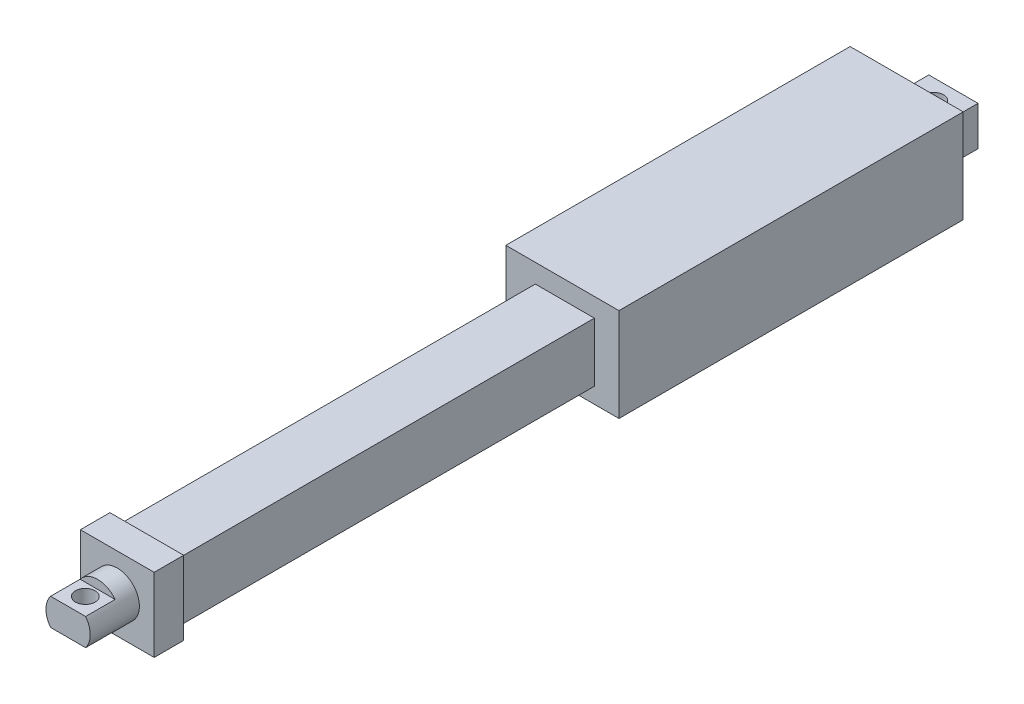
ISO-10303-21;
HEADER;
FILE_DESCRIPTION(('STEP AP214'),'2;1');
FILE_NAME('part.step','',(''),(''),'','','');
FILE_SCHEMA(('AUTOMOTIVE_DESIGN { 1 0 10303 214 1 1 1 1 }'));
ENDSEC;
DATA;
#1=APPLICATION_CONTEXT('core data for automotive mechanical design processes');
#2=APPLICATION_PROTOCOL_DEFINITION('international standard','automotive_design',2000,#1);
#3=PRODUCT_CONTEXT('',#1,'mechanical');
#4=PRODUCT('Part','Part','',(#3));
#5=PRODUCT_RELATED_PRODUCT_CATEGORY('part','',(#4));
#6=PRODUCT_DEFINITION_FORMATION('','',#4);
#7=PRODUCT_DEFINITION_CONTEXT('part definition',#1,'design');
#8=PRODUCT_DEFINITION('design','',#6,#7);
#9=PRODUCT_DEFINITION_SHAPE('','',#8);
#10=(LENGTH_UNIT() NAMED_UNIT(*) SI_UNIT(.MILLI.,.METRE.));
#11=(NAMED_UNIT(*) PLANE_ANGLE_UNIT() SI_UNIT($,.RADIAN.));
#12=(NAMED_UNIT(*) SI_UNIT($,.STERADIAN.) SOLID_ANGLE_UNIT());
#13=UNCERTAINTY_MEASURE_WITH_UNIT(LENGTH_MEASURE(1.E-05),#10,'distance_accuracy_value','');
#14=(GEOMETRIC_REPRESENTATION_CONTEXT(3) GLOBAL_UNCERTAINTY_ASSIGNED_CONTEXT((#13)) GLOBAL_UNIT_ASSIGNED_CONTEXT((#10,
#11,#12)) REPRESENTATION_CONTEXT('',''));
#15=CARTESIAN_POINT('',(0.,0.,0.));
#16=DIRECTION('',(0.,0.,1.));
#17=DIRECTION('',(1.,0.,0.));
#18=AXIS2_PLACEMENT_3D('',#15,#16,#17);
#19=CARTESIAN_POINT('',(0.268456375838915,1.1481543624161,171.));
#20=DIRECTION('',(0.,0.,-1.));
#21=DIRECTION('',(-1.,0.,0.));
#22=AXIS2_PLACEMENT_3D('',#19,#20,#21);
#23=CYLINDRICAL_SURFACE('',#22,4.5);
#24=CARTESIAN_POINT('',(0.268456375838915,1.1481543624161,161.));
#25=DIRECTION('',(0.,0.,1.));
#26=DIRECTION('',(1.,0.,0.));
#27=AXIS2_PLACEMENT_3D('',#24,#25,#26);
#28=CIRCLE('',#27,4.5);
#29=CARTESIAN_POINT('',(4.76845637583891,1.1481543624161,161.));
#30=VERTEX_POINT('',#29);
#31=EDGE_CURVE('E11',#30,#30,#28,.T.);
#32=ORIENTED_EDGE('',*,*,#31,.T.);
#33=EDGE_LOOP('',(#32));
#34=FACE_BOUND('',#33,.T.);
#35=DIRECTION('',(0.,0.,1.));
#36=VECTOR('',#35,1.);
#37=CARTESIAN_POINT('',(3.83040808803267,3.8981543624161,165.));
#38=LINE('',#37,#36);
#39=CARTESIAN_POINT('',(3.83040808803267,3.8981543624161,165.));
#40=VERTEX_POINT('',#39);
#41=CARTESIAN_POINT('',(3.83040808803267,3.8981543624161,171.));
#42=VERTEX_POINT('',#41);
#43=EDGE_CURVE('E178',#40,#42,#38,.T.);
#44=ORIENTED_EDGE('',*,*,#43,.T.);
#45=CARTESIAN_POINT('',(0.268456375838915,1.1481543624161,171.));
#46=DIRECTION('',(0.,0.,1.));
#47=DIRECTION('',(1.,0.,0.));
#48=AXIS2_PLACEMENT_3D('',#45,#46,#47);
#49=CIRCLE('',#48,4.5);
#50=CARTESIAN_POINT('',(3.83040808803267,-1.6018456375839,171.));
#51=VERTEX_POINT('',#50);
#52=EDGE_CURVE('E204',#51,#42,#49,.T.);
#53=ORIENTED_EDGE('',*,*,#52,.F.);
#54=DIRECTION('',(0.,0.,1.));
#55=VECTOR('',#54,1.);
#56=CARTESIAN_POINT('',(3.83040808803267,-1.6018456375839,165.));
#57=LINE('',#56,#55);
#58=CARTESIAN_POINT('',(3.83040808803267,-1.6018456375839,165.));
#59=VERTEX_POINT('',#58);
#60=EDGE_CURVE('E57',#59,#51,#57,.T.);
#61=ORIENTED_EDGE('',*,*,#60,.F.);
#62=CARTESIAN_POINT('',(0.268456375838915,1.1481543624161,165.));
#63=DIRECTION('',(0.,0.,1.));
#64=DIRECTION('',(1.,0.,0.));
#65=AXIS2_PLACEMENT_3D('',#62,#63,#64);
#66=CIRCLE('',#65,4.5);
#67=CARTESIAN_POINT('',(-3.29349533635484,-1.6018456375839,165.));
#68=VERTEX_POINT('',#67);
#69=EDGE_CURVE('E206',#68,#59,#66,.T.);
#70=ORIENTED_EDGE('',*,*,#69,.F.);
#71=DIRECTION('',(0.,0.,1.));
#72=VECTOR('',#71,1.);
#73=CARTESIAN_POINT('',(-3.29349533635484,-1.6018456375839,165.));
#74=LINE('',#73,#72);
#75=CARTESIAN_POINT('',(-3.29349533635484,-1.6018456375839,171.));
#76=VERTEX_POINT('',#75);
#77=EDGE_CURVE('E202',#68,#76,#74,.T.);
#78=ORIENTED_EDGE('',*,*,#77,.T.);
#79=CARTESIAN_POINT('',(-3.29349533635484,3.8981543624161,171.));
#80=VERTEX_POINT('',#79);
#81=EDGE_CURVE('E223',#80,#76,#49,.T.);
#82=ORIENTED_EDGE('',*,*,#81,.F.);
#83=DIRECTION('',(0.,0.,1.));
#84=VECTOR('',#83,1.);
#85=CARTESIAN_POINT('',(-3.29349533635484,3.8981543624161,165.));
#86=LINE('',#85,#84);
#87=CARTESIAN_POINT('',(-3.29349533635484,3.8981543624161,165.));
#88=VERTEX_POINT('',#87);
#89=EDGE_CURVE('E65',#88,#80,#86,.T.);
#90=ORIENTED_EDGE('',*,*,#89,.F.);
#91=CARTESIAN_POINT('',(0.268456375838915,1.1481543624161,165.));
#92=DIRECTION('',(0.,0.,1.));
#93=DIRECTION('',(1.,0.,0.));
#94=AXIS2_PLACEMENT_3D('',#91,#92,#93);
#95=CIRCLE('',#94,4.5);
#96=EDGE_CURVE('E189',#40,#88,#95,.T.);
#97=ORIENTED_EDGE('',*,*,#96,.F.);
#98=EDGE_LOOP('',(#44,#53,#61,#70,#78,#82,#90,#97));
#99=FACE_BOUND('',#98,.T.);
#100=ADVANCED_FACE('F40',(#34,#99),#23,.T.);
#101=CARTESIAN_POINT('',(0.,0.,171.));
#102=DIRECTION('',(0.,0.,1.));
#103=DIRECTION('',(1.,0.,0.));
#104=AXIS2_PLACEMENT_3D('',#101,#102,#103);
#105=PLANE('',#104);
#106=ORIENTED_EDGE('',*,*,#52,.T.);
#107=DIRECTION('',(-1.,0.,0.));
#108=VECTOR('',#107,1.);
#109=CARTESIAN_POINT('',(0.,3.8981543624161,171.));
#110=LINE('',#109,#108);
#111=EDGE_CURVE('E183',#42,#80,#110,.T.);
#112=ORIENTED_EDGE('',*,*,#111,.T.);
#113=ORIENTED_EDGE('',*,*,#81,.T.);
#114=DIRECTION('',(-1.,0.,0.));
#115=VECTOR('',#114,1.);
#116=CARTESIAN_POINT('',(0.,-1.6018456375839,171.));
#117=LINE('',#116,#115);
#118=EDGE_CURVE('E210',#51,#76,#117,.T.);
#119=ORIENTED_EDGE('',*,*,#118,.F.);
#120=EDGE_LOOP('',(#106,#112,#113,#119));
#121=FACE_BOUND('',#120,.T.);
#122=ADVANCED_FACE('F442',(#121),#105,.T.);
#123=CARTESIAN_POINT('',(0.,0.,0.));
#124=DIRECTION('',(0.,0.,1.));
#125=DIRECTION('',(1.,0.,0.));
#126=AXIS2_PLACEMENT_3D('',#123,#124,#125);
#127=PLANE('',#126);
#128=DIRECTION('',(0.,-1.,0.));
#129=VECTOR('',#128,1.);
#130=CARTESIAN_POINT('',(-11.7315436241611,10.9731543624161,0.));
#131=LINE('',#130,#129);
#132=CARTESIAN_POINT('',(-11.7315436241611,10.9731543624161,0.));
#133=VERTEX_POINT('',#132);
#134=CARTESIAN_POINT('',(-11.7315436241611,-8.02684563758389,0.));
#135=VERTEX_POINT('',#134);
#136=EDGE_CURVE('E368',#133,#135,#131,.T.);
#137=ORIENTED_EDGE('',*,*,#136,.F.);
#138=DIRECTION('',(-1.,0.,0.));
#139=VECTOR('',#138,1.);
#140=CARTESIAN_POINT('',(-11.7315436241611,10.9731543624161,0.));
#141=LINE('',#140,#139);
#142=CARTESIAN_POINT('',(11.2684563758389,10.9731543624161,0.));
#143=VERTEX_POINT('',#142);
#144=EDGE_CURVE('E374',#143,#133,#141,.T.);
#145=ORIENTED_EDGE('',*,*,#144,.F.);
#146=DIRECTION('',(0.,1.,0.));
#147=VECTOR('',#146,1.);
#148=CARTESIAN_POINT('',(11.2684563758389,10.9731543624161,0.));
#149=LINE('',#148,#147);
#150=CARTESIAN_POINT('',(11.2684563758389,-8.02684563758389,0.));
#151=VERTEX_POINT('',#150);
#152=EDGE_CURVE('E390',#151,#143,#149,.T.);
#153=ORIENTED_EDGE('',*,*,#152,.F.);
#154=DIRECTION('',(1.,0.,0.));
#155=VECTOR('',#154,1.);
#156=CARTESIAN_POINT('',(-11.7315436241611,-8.02684563758389,0.));
#157=LINE('',#156,#155);
#158=EDGE_CURVE('E387',#135,#151,#157,.T.);
#159=ORIENTED_EDGE('',*,*,#158,.F.);
#160=EDGE_LOOP('',(#137,#145,#153,#159));
#161=FACE_BOUND('',#160,.T.);
#162=DIRECTION('',(0.,-1.,0.));
#163=VECTOR('',#162,1.);
#164=CARTESIAN_POINT('',(5.26845637583892,4.97315436241611,0.));
#165=LINE('',#164,#163);
#166=CARTESIAN_POINT('',(5.26845637583892,4.97315436241611,0.));
#167=VERTEX_POINT('',#166);
#168=CARTESIAN_POINT('',(5.26845637583892,-3.02684563758389,0.));
#169=VERTEX_POINT('',#168);
#170=EDGE_CURVE('E323',#167,#169,#165,.T.);
#171=ORIENTED_EDGE('',*,*,#170,.F.);
#172=DIRECTION('',(1.,0.,0.));
#173=VECTOR('',#172,1.);
#174=CARTESIAN_POINT('',(5.26845637583892,4.97315436241611,0.));
#175=LINE('',#174,#173);
#176=CARTESIAN_POINT('',(-4.73154362416108,4.97315436241611,0.));
#177=VERTEX_POINT('',#176);
#178=EDGE_CURVE('E329',#177,#167,#175,.T.);
#179=ORIENTED_EDGE('',*,*,#178,.F.);
#180=DIRECTION('',(0.,1.,0.));
#181=VECTOR('',#180,1.);
#182=CARTESIAN_POINT('',(-4.73154362416108,4.97315436241611,0.));
#183=LINE('',#182,#181);
#184=CARTESIAN_POINT('',(-4.73154362416109,-3.02684563758389,0.));
#185=VERTEX_POINT('',#184);
#186=EDGE_CURVE('E346',#185,#177,#183,.T.);
#187=ORIENTED_EDGE('',*,*,#186,.F.);
#188=DIRECTION('',(-1.,0.,0.));
#189=VECTOR('',#188,1.);
#190=CARTESIAN_POINT('',(5.26845637583892,-3.02684563758389,0.));
#191=LINE('',#190,#189);
#192=EDGE_CURVE('E342',#169,#185,#191,.T.);
#193=ORIENTED_EDGE('',*,*,#192,.F.);
#194=EDGE_LOOP('',(#171,#179,#187,#193));
#195=FACE_BOUND('',#194,.T.);
#196=ADVANCED_FACE('F419',(#161,#195),#127,.F.);
#197=CARTESIAN_POINT('',(-11.7315436241611,10.9731543624161,70.));
#198=DIRECTION('',(1.,0.,0.));
#199=DIRECTION('',(0.,1.,0.));
#200=AXIS2_PLACEMENT_3D('',#197,#198,#199);
#201=PLANE('',#200);
#202=ORIENTED_EDGE('',*,*,#136,.T.);
#203=DIRECTION('',(0.,0.,-1.));
#204=VECTOR('',#203,1.);
#205=CARTESIAN_POINT('',(-11.7315436241611,-8.02684563758389,70.));
#206=LINE('',#205,#204);
#207=CARTESIAN_POINT('',(-11.7315436241611,-8.02684563758389,70.));
#208=VERTEX_POINT('',#207);
#209=EDGE_CURVE('E44',#208,#135,#206,.T.);
#210=ORIENTED_EDGE('',*,*,#209,.F.);
#211=DIRECTION('',(0.,-1.,0.));
#212=VECTOR('',#211,1.);
#213=CARTESIAN_POINT('',(-11.7315436241611,10.9731543624161,70.));
#214=LINE('',#213,#212);
#215=CARTESIAN_POINT('',(-11.7315436241611,10.9731543624161,70.));
#216=VERTEX_POINT('',#215);
#217=EDGE_CURVE('E369',#216,#208,#214,.T.);
#218=ORIENTED_EDGE('',*,*,#217,.F.);
#219=DIRECTION('',(0.,0.,-1.));
#220=VECTOR('',#219,1.);
#221=CARTESIAN_POINT('',(-11.7315436241611,10.9731543624161,70.));
#222=LINE('',#221,#220);
#223=EDGE_CURVE('E383',#216,#133,#222,.T.);
#224=ORIENTED_EDGE('',*,*,#223,.T.);
#225=EDGE_LOOP('',(#202,#210,#218,#224));
#226=FACE_BOUND('',#225,.T.);
#227=ADVANCED_FACE('F42',(#226),#201,.F.);
#228=CARTESIAN_POINT('',(-11.7315436241611,-8.02684563758389,70.));
#229=DIRECTION('',(0.,1.,0.));
#230=DIRECTION('',(0.,0.,1.));
#231=AXIS2_PLACEMENT_3D('',#228,#229,#230);
#232=PLANE('',#231);
#233=ORIENTED_EDGE('',*,*,#158,.T.);
#234=DIRECTION('',(0.,0.,-1.));
#235=VECTOR('',#234,1.);
#236=CARTESIAN_POINT('',(11.2684563758389,-8.02684563758389,70.));
#237=LINE('',#236,#235);
#238=CARTESIAN_POINT('',(11.2684563758389,-8.02684563758389,70.));
#239=VERTEX_POINT('',#238);
#240=EDGE_CURVE('E401',#239,#151,#237,.T.);
#241=ORIENTED_EDGE('',*,*,#240,.F.);
#242=DIRECTION('',(1.,0.,0.));
#243=VECTOR('',#242,1.);
#244=CARTESIAN_POINT('',(-11.7315436241611,-8.02684563758389,70.));
#245=LINE('',#244,#243);
#246=EDGE_CURVE('E373',#208,#239,#245,.T.);
#247=ORIENTED_EDGE('',*,*,#246,.F.);
#248=ORIENTED_EDGE('',*,*,#209,.T.);
#249=EDGE_LOOP('',(#233,#241,#247,#248));
#250=FACE_BOUND('',#249,.T.);
#251=ADVANCED_FACE('F412',(#250),#232,.F.);
#252=CARTESIAN_POINT('',(11.2684563758389,10.9731543624161,70.));
#253=DIRECTION('',(-1.,0.,0.));
#254=DIRECTION('',(0.,-1.,0.));
#255=AXIS2_PLACEMENT_3D('',#252,#253,#254);
#256=PLANE('',#255);
#257=ORIENTED_EDGE('',*,*,#152,.T.);
#258=DIRECTION('',(0.,0.,-1.));
#259=VECTOR('',#258,1.);
#260=CARTESIAN_POINT('',(11.2684563758389,10.9731543624161,70.));
#261=LINE('',#260,#259);
#262=CARTESIAN_POINT('',(11.2684563758389,10.9731543624161,70.));
#263=VERTEX_POINT('',#262);
#264=EDGE_CURVE('E398',#263,#143,#261,.T.);
#265=ORIENTED_EDGE('',*,*,#264,.F.);
#266=DIRECTION('',(0.,1.,0.));
#267=VECTOR('',#266,1.);
#268=CARTESIAN_POINT('',(11.2684563758389,10.9731543624161,70.));
#269=LINE('',#268,#267);
#270=EDGE_CURVE('E377',#239,#263,#269,.T.);
#271=ORIENTED_EDGE('',*,*,#270,.F.);
#272=ORIENTED_EDGE('',*,*,#240,.T.);
#273=EDGE_LOOP('',(#257,#265,#271,#272));
#274=FACE_BOUND('',#273,.T.);
#275=ADVANCED_FACE('F422',(#274),#256,.F.);
#276=CARTESIAN_POINT('',(-11.7315436241611,10.9731543624161,70.));
#277=DIRECTION('',(0.,-1.,0.));
#278=DIRECTION('',(0.,0.,-1.));
#279=AXIS2_PLACEMENT_3D('',#276,#277,#278);
#280=PLANE('',#279);
#281=ORIENTED_EDGE('',*,*,#144,.T.);
#282=ORIENTED_EDGE('',*,*,#223,.F.);
#283=DIRECTION('',(-1.,0.,0.));
#284=VECTOR('',#283,1.);
#285=CARTESIAN_POINT('',(-11.7315436241611,10.9731543624161,70.));
#286=LINE('',#285,#284);
#287=EDGE_CURVE('E380',#263,#216,#286,.T.);
#288=ORIENTED_EDGE('',*,*,#287,.F.);
#289=ORIENTED_EDGE('',*,*,#264,.T.);
#290=EDGE_LOOP('',(#281,#282,#288,#289));
#291=FACE_BOUND('',#290,.T.);
#292=ADVANCED_FACE('F425',(#291),#280,.F.);
#293=CARTESIAN_POINT('',(0.,0.,70.));
#294=DIRECTION('',(0.,0.,1.));
#295=DIRECTION('',(1.,0.,0.));
#296=AXIS2_PLACEMENT_3D('',#293,#294,#295);
#297=PLANE('',#296);
#298=DIRECTION('',(0.,1.,0.));
#299=VECTOR('',#298,1.);
#300=CARTESIAN_POINT('',(6.26845637583892,-4.85184563758389,70.));
#301=LINE('',#300,#299);
#302=CARTESIAN_POINT('',(6.26845637583892,-4.85184563758389,70.));
#303=VERTEX_POINT('',#302);
#304=CARTESIAN_POINT('',(6.26845637583892,7.14815436241611,70.));
#305=VERTEX_POINT('',#304);
#306=EDGE_CURVE('E267',#303,#305,#301,.T.);
#307=ORIENTED_EDGE('',*,*,#306,.F.);
#308=DIRECTION('',(1.,0.,0.));
#309=VECTOR('',#308,1.);
#310=CARTESIAN_POINT('',(6.26845637583892,-4.85184563758389,70.));
#311=LINE('',#310,#309);
#312=CARTESIAN_POINT('',(-5.73154362416108,-4.85184563758389,70.));
#313=VERTEX_POINT('',#312);
#314=EDGE_CURVE('E273',#313,#303,#311,.T.);
#315=ORIENTED_EDGE('',*,*,#314,.F.);
#316=DIRECTION('',(0.,-1.,0.));
#317=VECTOR('',#316,1.);
#318=CARTESIAN_POINT('',(-5.73154362416108,-4.85184563758389,70.));
#319=LINE('',#318,#317);
#320=CARTESIAN_POINT('',(-5.73154362416108,7.14815436241611,70.));
#321=VERTEX_POINT('',#320);
#322=EDGE_CURVE('E293',#321,#313,#319,.T.);
#323=ORIENTED_EDGE('',*,*,#322,.F.);
#324=DIRECTION('',(-1.,0.,0.));
#325=VECTOR('',#324,1.);
#326=CARTESIAN_POINT('',(6.26845637583892,7.14815436241611,70.));
#327=LINE('',#326,#325);
#328=EDGE_CURVE('E289',#305,#321,#327,.T.);
#329=ORIENTED_EDGE('',*,*,#328,.F.);
#330=EDGE_LOOP('',(#307,#315,#323,#329));
#331=FACE_BOUND('',#330,.T.);
#332=ORIENTED_EDGE('',*,*,#217,.T.);
#333=ORIENTED_EDGE('',*,*,#246,.T.);
#334=ORIENTED_EDGE('',*,*,#270,.T.);
#335=ORIENTED_EDGE('',*,*,#287,.T.);
#336=EDGE_LOOP('',(#332,#333,#334,#335));
#337=FACE_BOUND('',#336,.T.);
#338=ADVANCED_FACE('F427',(#331,#337),#297,.T.);
#339=CARTESIAN_POINT('',(5.26845637583892,4.97315436241611,-9.));
#340=DIRECTION('',(-1.,0.,0.));
#341=DIRECTION('',(0.,0.,1.));
#342=AXIS2_PLACEMENT_3D('',#339,#340,#341);
#343=PLANE('',#342);
#344=ORIENTED_EDGE('',*,*,#170,.T.);
#345=DIRECTION('',(0.,0.,1.));
#346=VECTOR('',#345,1.);
#347=CARTESIAN_POINT('',(5.26845637583892,-3.02684563758389,-9.));
#348=LINE('',#347,#346);
#349=CARTESIAN_POINT('',(5.26845637583892,-3.02684563758389,-9.));
#350=VERTEX_POINT('',#349);
#351=EDGE_CURVE('E364',#350,#169,#348,.T.);
#352=ORIENTED_EDGE('',*,*,#351,.F.);
#353=DIRECTION('',(0.,-1.,0.));
#354=VECTOR('',#353,1.);
#355=CARTESIAN_POINT('',(5.26845637583892,4.97315436241611,-9.));
#356=LINE('',#355,#354);
#357=CARTESIAN_POINT('',(5.26845637583892,4.97315436241611,-9.));
#358=VERTEX_POINT('',#357);
#359=EDGE_CURVE('E324',#358,#350,#356,.T.);
#360=ORIENTED_EDGE('',*,*,#359,.F.);
#361=DIRECTION('',(0.,0.,1.));
#362=VECTOR('',#361,1.);
#363=CARTESIAN_POINT('',(5.26845637583892,4.97315436241611,-9.));
#364=LINE('',#363,#362);
#365=EDGE_CURVE('E338',#358,#167,#364,.T.);
#366=ORIENTED_EDGE('',*,*,#365,.T.);
#367=EDGE_LOOP('',(#344,#352,#360,#366));
#368=FACE_BOUND('',#367,.T.);
#369=ADVANCED_FACE('F429',(#368),#343,.F.);
#370=CARTESIAN_POINT('',(5.26845637583892,-3.02684563758389,-9.));
#371=DIRECTION('',(0.,1.,0.));
#372=DIRECTION('',(0.,0.,1.));
#373=AXIS2_PLACEMENT_3D('',#370,#371,#372);
#374=PLANE('',#373);
#375=CARTESIAN_POINT('',(0.268456375838916,-3.02684563758389,-5.));
#376=DIRECTION('',(0.,1.,0.));
#377=DIRECTION('',(0.,0.,1.));
#378=AXIS2_PLACEMENT_3D('',#375,#376,#377);
#379=CIRCLE('',#378,2.);
#380=CARTESIAN_POINT('',(0.268456375838916,-3.02684563758389,-3.));
#381=VERTEX_POINT('',#380);
#382=EDGE_CURVE('E319',#381,#381,#379,.T.);
#383=ORIENTED_EDGE('',*,*,#382,.T.);
#384=EDGE_LOOP('',(#383));
#385=FACE_BOUND('',#384,.T.);
#386=ORIENTED_EDGE('',*,*,#192,.T.);
#387=DIRECTION('',(0.,0.,1.));
#388=VECTOR('',#387,1.);
#389=CARTESIAN_POINT('',(-4.73154362416109,-3.02684563758389,-9.));
#390=LINE('',#389,#388);
#391=CARTESIAN_POINT('',(-4.73154362416109,-3.02684563758389,-9.));
#392=VERTEX_POINT('',#391);
#393=EDGE_CURVE('E360',#392,#185,#390,.T.);
#394=ORIENTED_EDGE('',*,*,#393,.F.);
#395=DIRECTION('',(-1.,0.,0.));
#396=VECTOR('',#395,1.);
#397=CARTESIAN_POINT('',(5.26845637583892,-3.02684563758389,-9.));
#398=LINE('',#397,#396);
#399=EDGE_CURVE('E328',#350,#392,#398,.T.);
#400=ORIENTED_EDGE('',*,*,#399,.F.);
#401=ORIENTED_EDGE('',*,*,#351,.T.);
#402=EDGE_LOOP('',(#386,#394,#400,#401));
#403=FACE_BOUND('',#402,.T.);
#404=ADVANCED_FACE('F436',(#385,#403),#374,.F.);
#405=CARTESIAN_POINT('',(-4.73154362416108,4.97315436241611,-9.));
#406=DIRECTION('',(1.,0.,0.));
#407=DIRECTION('',(0.,1.,0.));
#408=AXIS2_PLACEMENT_3D('',#405,#406,#407);
#409=PLANE('',#408);
#410=ORIENTED_EDGE('',*,*,#186,.T.);
#411=DIRECTION('',(0.,0.,1.));
#412=VECTOR('',#411,1.);
#413=CARTESIAN_POINT('',(-4.73154362416108,4.97315436241611,-9.));
#414=LINE('',#413,#412);
#415=CARTESIAN_POINT('',(-4.73154362416108,4.97315436241611,-9.));
#416=VERTEX_POINT('',#415);
#417=EDGE_CURVE('E356',#416,#177,#414,.T.);
#418=ORIENTED_EDGE('',*,*,#417,.F.);
#419=DIRECTION('',(0.,1.,0.));
#420=VECTOR('',#419,1.);
#421=CARTESIAN_POINT('',(-4.73154362416108,4.97315436241611,-9.));
#422=LINE('',#421,#420);
#423=EDGE_CURVE('E332',#392,#416,#422,.T.);
#424=ORIENTED_EDGE('',*,*,#423,.F.);
#425=ORIENTED_EDGE('',*,*,#393,.T.);
#426=EDGE_LOOP('',(#410,#418,#424,#425));
#427=FACE_BOUND('',#426,.T.);
#428=ADVANCED_FACE('F504',(#427),#409,.F.);
#429=CARTESIAN_POINT('',(5.26845637583892,4.97315436241611,-9.));
#430=DIRECTION('',(0.,-1.,0.));
#431=DIRECTION('',(1.,0.,0.));
#432=AXIS2_PLACEMENT_3D('',#429,#430,#431);
#433=PLANE('',#432);
#434=CARTESIAN_POINT('',(0.268456375838916,4.97315436241611,-5.));
#435=DIRECTION('',(0.,1.,0.));
#436=DIRECTION('',(-1.,0.,0.));
#437=AXIS2_PLACEMENT_3D('',#434,#435,#436);
#438=CIRCLE('',#437,2.);
#439=CARTESIAN_POINT('',(-1.73154362416108,4.97315436241611,-5.));
#440=VERTEX_POINT('',#439);
#441=EDGE_CURVE('E315',#440,#440,#438,.T.);
#442=ORIENTED_EDGE('',*,*,#441,.F.);
#443=EDGE_LOOP('',(#442));
#444=FACE_BOUND('',#443,.T.);
#445=ORIENTED_EDGE('',*,*,#178,.T.);
#446=ORIENTED_EDGE('',*,*,#365,.F.);
#447=DIRECTION('',(1.,0.,0.));
#448=VECTOR('',#447,1.);
#449=CARTESIAN_POINT('',(5.26845637583892,4.97315436241611,-9.));
#450=LINE('',#449,#448);
#451=EDGE_CURVE('E335',#416,#358,#450,.T.);
#452=ORIENTED_EDGE('',*,*,#451,.F.);
#453=ORIENTED_EDGE('',*,*,#417,.T.);
#454=EDGE_LOOP('',(#445,#446,#452,#453));
#455=FACE_BOUND('',#454,.T.);
#456=ADVANCED_FACE('F500',(#444,#455),#433,.F.);
#457=CARTESIAN_POINT('',(0.,0.,-9.));
#458=DIRECTION('',(0.,0.,-1.));
#459=DIRECTION('',(-1.,0.,0.));
#460=AXIS2_PLACEMENT_3D('',#457,#458,#459);
#461=PLANE('',#460);
#462=ORIENTED_EDGE('',*,*,#359,.T.);
#463=ORIENTED_EDGE('',*,*,#399,.T.);
#464=ORIENTED_EDGE('',*,*,#423,.T.);
#465=ORIENTED_EDGE('',*,*,#451,.T.);
#466=EDGE_LOOP('',(#462,#463,#464,#465));
#467=FACE_BOUND('',#466,.T.);
#468=ADVANCED_FACE('F496',(#467),#461,.T.);
#469=CARTESIAN_POINT('',(0.268456375838915,-8.02684563758389,-5.));
#470=DIRECTION('',(0.,1.,0.));
#471=DIRECTION('',(-1.,0.,0.));
#472=AXIS2_PLACEMENT_3D('',#469,#470,#471);
#473=CYLINDRICAL_SURFACE('',#472,2.);
#474=ORIENTED_EDGE('',*,*,#441,.T.);
#475=EDGE_LOOP('',(#474));
#476=FACE_BOUND('',#475,.T.);
#477=ORIENTED_EDGE('',*,*,#382,.F.);
#478=EDGE_LOOP('',(#477));
#479=FACE_BOUND('',#478,.T.);
#480=ADVANCED_FACE('F492',(#476,#479),#473,.F.);
#481=CARTESIAN_POINT('',(6.26845637583892,-4.85184563758389,155.));
#482=DIRECTION('',(-1.,0.,0.));
#483=DIRECTION('',(0.,-1.,0.));
#484=AXIS2_PLACEMENT_3D('',#481,#482,#483);
#485=PLANE('',#484);
#486=ORIENTED_EDGE('',*,*,#306,.T.);
#487=DIRECTION('',(0.,0.,-1.));
#488=VECTOR('',#487,1.);
#489=CARTESIAN_POINT('',(6.26845637583892,7.14815436241611,155.));
#490=LINE('',#489,#488);
#491=CARTESIAN_POINT('',(6.26845637583892,7.14815436241611,155.));
#492=VERTEX_POINT('',#491);
#493=EDGE_CURVE('E311',#492,#305,#490,.T.);
#494=ORIENTED_EDGE('',*,*,#493,.F.);
#495=DIRECTION('',(0.,1.,0.));
#496=VECTOR('',#495,1.);
#497=CARTESIAN_POINT('',(6.26845637583892,-4.85184563758389,155.));
#498=LINE('',#497,#496);
#499=CARTESIAN_POINT('',(6.26845637583892,-4.85184563758389,155.));
#500=VERTEX_POINT('',#499);
#501=EDGE_CURVE('E268',#500,#492,#498,.T.);
#502=ORIENTED_EDGE('',*,*,#501,.F.);
#503=DIRECTION('',(0.,0.,-1.));
#504=VECTOR('',#503,1.);
#505=CARTESIAN_POINT('',(6.26845637583892,-4.85184563758389,155.));
#506=LINE('',#505,#504);
#507=EDGE_CURVE('E285',#500,#303,#506,.T.);
#508=ORIENTED_EDGE('',*,*,#507,.T.);
#509=EDGE_LOOP('',(#486,#494,#502,#508));
#510=FACE_BOUND('',#509,.T.);
#511=ADVANCED_FACE('F488',(#510),#485,.F.);
#512=CARTESIAN_POINT('',(6.26845637583892,7.14815436241611,155.));
#513=DIRECTION('',(0.,-1.,0.));
#514=DIRECTION('',(1.,0.,0.));
#515=AXIS2_PLACEMENT_3D('',#512,#513,#514);
#516=PLANE('',#515);
#517=ORIENTED_EDGE('',*,*,#328,.T.);
#518=DIRECTION('',(0.,0.,-1.));
#519=VECTOR('',#518,1.);
#520=CARTESIAN_POINT('',(-5.73154362416108,7.14815436241611,155.));
#521=LINE('',#520,#519);
#522=CARTESIAN_POINT('',(-5.73154362416108,7.14815436241611,155.));
#523=VERTEX_POINT('',#522);
#524=EDGE_CURVE('E307',#523,#321,#521,.T.);
#525=ORIENTED_EDGE('',*,*,#524,.F.);
#526=DIRECTION('',(-1.,0.,0.));
#527=VECTOR('',#526,1.);
#528=CARTESIAN_POINT('',(6.26845637583892,7.14815436241611,155.));
#529=LINE('',#528,#527);
#530=EDGE_CURVE('E272',#492,#523,#529,.T.);
#531=ORIENTED_EDGE('',*,*,#530,.F.);
#532=ORIENTED_EDGE('',*,*,#493,.T.);
#533=EDGE_LOOP('',(#517,#525,#531,#532));
#534=FACE_BOUND('',#533,.T.);
#535=ADVANCED_FACE('F484',(#534),#516,.F.);
#536=CARTESIAN_POINT('',(-5.73154362416108,-4.85184563758389,155.));
#537=DIRECTION('',(1.,0.,0.));
#538=DIRECTION('',(0.,0.,-1.));
#539=AXIS2_PLACEMENT_3D('',#536,#537,#538);
#540=PLANE('',#539);
#541=ORIENTED_EDGE('',*,*,#322,.T.);
#542=DIRECTION('',(0.,0.,-1.));
#543=VECTOR('',#542,1.);
#544=CARTESIAN_POINT('',(-5.73154362416108,-4.85184563758389,155.));
#545=LINE('',#544,#543);
#546=CARTESIAN_POINT('',(-5.73154362416108,-4.85184563758389,155.));
#547=VERTEX_POINT('',#546);
#548=EDGE_CURVE('E303',#547,#313,#545,.T.);
#549=ORIENTED_EDGE('',*,*,#548,.F.);
#550=DIRECTION('',(0.,-1.,0.));
#551=VECTOR('',#550,1.);
#552=CARTESIAN_POINT('',(-5.73154362416108,-4.85184563758389,155.));
#553=LINE('',#552,#551);
#554=EDGE_CURVE('E277',#523,#547,#553,.T.);
#555=ORIENTED_EDGE('',*,*,#554,.F.);
#556=ORIENTED_EDGE('',*,*,#524,.T.);
#557=EDGE_LOOP('',(#541,#549,#555,#556));
#558=FACE_BOUND('',#557,.T.);
#559=ADVANCED_FACE('F480',(#558),#540,.F.);
#560=CARTESIAN_POINT('',(6.26845637583892,-4.85184563758389,155.));
#561=DIRECTION('',(0.,1.,0.));
#562=DIRECTION('',(-1.,0.,0.));
#563=AXIS2_PLACEMENT_3D('',#560,#561,#562);
#564=PLANE('',#563);
#565=ORIENTED_EDGE('',*,*,#314,.T.);
#566=ORIENTED_EDGE('',*,*,#507,.F.);
#567=DIRECTION('',(1.,0.,0.));
#568=VECTOR('',#567,1.);
#569=CARTESIAN_POINT('',(6.26845637583892,-4.85184563758389,155.));
#570=LINE('',#569,#568);
#571=EDGE_CURVE('E281',#547,#500,#570,.T.);
#572=ORIENTED_EDGE('',*,*,#571,.F.);
#573=ORIENTED_EDGE('',*,*,#548,.T.);
#574=EDGE_LOOP('',(#565,#566,#572,#573));
#575=FACE_BOUND('',#574,.T.);
#576=ADVANCED_FACE('F462',(#575),#564,.F.);
#577=CARTESIAN_POINT('',(0.,0.,155.));
#578=DIRECTION('',(0.,0.,1.));
#579=DIRECTION('',(1.,0.,0.));
#580=AXIS2_PLACEMENT_3D('',#577,#578,#579);
#581=PLANE('',#580);
#582=DIRECTION('',(0.,1.,0.));
#583=VECTOR('',#582,1.);
#584=CARTESIAN_POINT('',(7.76845637583891,-6.3518456375839,155.));
#585=LINE('',#584,#583);
#586=CARTESIAN_POINT('',(7.76845637583891,-6.3518456375839,155.));
#587=VERTEX_POINT('',#586);
#588=CARTESIAN_POINT('',(7.76845637583891,8.64815436241611,155.));
#589=VERTEX_POINT('',#588);
#590=EDGE_CURVE('E240',#587,#589,#585,.T.);
#591=ORIENTED_EDGE('',*,*,#590,.F.);
#592=DIRECTION('',(1.,0.,0.));
#593=VECTOR('',#592,1.);
#594=CARTESIAN_POINT('',(7.76845637583891,-6.3518456375839,155.));
#595=LINE('',#594,#593);
#596=CARTESIAN_POINT('',(-7.23154362416108,-6.3518456375839,155.));
#597=VERTEX_POINT('',#596);
#598=EDGE_CURVE('E230',#597,#587,#595,.T.);
#599=ORIENTED_EDGE('',*,*,#598,.F.);
#600=DIRECTION('',(0.,-1.,0.));
#601=VECTOR('',#600,1.);
#602=CARTESIAN_POINT('',(-7.23154362416108,-6.3518456375839,155.));
#603=LINE('',#602,#601);
#604=CARTESIAN_POINT('',(-7.23154362416108,8.6481543624161,155.));
#605=VERTEX_POINT('',#604);
#606=EDGE_CURVE('E247',#605,#597,#603,.T.);
#607=ORIENTED_EDGE('',*,*,#606,.F.);
#608=DIRECTION('',(-1.,0.,0.));
#609=VECTOR('',#608,1.);
#610=CARTESIAN_POINT('',(7.76845637583891,8.64815436241611,155.));
#611=LINE('',#610,#609);
#612=EDGE_CURVE('E244',#589,#605,#611,.T.);
#613=ORIENTED_EDGE('',*,*,#612,.F.);
#614=EDGE_LOOP('',(#591,#599,#607,#613));
#615=FACE_BOUND('',#614,.T.);
#616=ORIENTED_EDGE('',*,*,#571,.T.);
#617=ORIENTED_EDGE('',*,*,#501,.T.);
#618=ORIENTED_EDGE('',*,*,#530,.T.);
#619=ORIENTED_EDGE('',*,*,#554,.T.);
#620=EDGE_LOOP('',(#616,#617,#618,#619));
#621=FACE_BOUND('',#620,.T.);
#622=ADVANCED_FACE('F458',(#615,#621),#581,.F.);
#623=CARTESIAN_POINT('',(7.76845637583891,-6.3518456375839,161.));
#624=DIRECTION('',(-1.,0.,0.));
#625=DIRECTION('',(0.,0.,1.));
#626=AXIS2_PLACEMENT_3D('',#623,#624,#625);
#627=PLANE('',#626);
#628=ORIENTED_EDGE('',*,*,#590,.T.);
#629=DIRECTION('',(0.,0.,-1.));
#630=VECTOR('',#629,1.);
#631=CARTESIAN_POINT('',(7.76845637583891,8.64815436241611,161.));
#632=LINE('',#631,#630);
#633=CARTESIAN_POINT('',(7.76845637583891,8.64815436241611,161.));
#634=VERTEX_POINT('',#633);
#635=EDGE_CURVE('E263',#634,#589,#632,.T.);
#636=ORIENTED_EDGE('',*,*,#635,.F.);
#637=DIRECTION('',(0.,1.,0.));
#638=VECTOR('',#637,1.);
#639=CARTESIAN_POINT('',(7.76845637583891,-6.3518456375839,161.));
#640=LINE('',#639,#638);
#641=CARTESIAN_POINT('',(7.76845637583891,-6.3518456375839,161.));
#642=VERTEX_POINT('',#641);
#643=EDGE_CURVE('E225',#642,#634,#640,.T.);
#644=ORIENTED_EDGE('',*,*,#643,.F.);
#645=DIRECTION('',(0.,0.,-1.));
#646=VECTOR('',#645,1.);
#647=CARTESIAN_POINT('',(7.76845637583891,-6.3518456375839,161.));
#648=LINE('',#647,#646);
#649=EDGE_CURVE('E239',#642,#587,#648,.T.);
#650=ORIENTED_EDGE('',*,*,#649,.T.);
#651=EDGE_LOOP('',(#628,#636,#644,#650));
#652=FACE_BOUND('',#651,.T.);
#653=ADVANCED_FACE('F461',(#652),#627,.F.);
#654=CARTESIAN_POINT('',(7.76845637583891,8.64815436241611,161.));
#655=DIRECTION('',(0.,-1.,0.));
#656=DIRECTION('',(1.,0.,0.));
#657=AXIS2_PLACEMENT_3D('',#654,#655,#656);
#658=PLANE('',#657);
#659=ORIENTED_EDGE('',*,*,#612,.T.);
#660=DIRECTION('',(0.,0.,-1.));
#661=VECTOR('',#660,1.);
#662=CARTESIAN_POINT('',(-7.23154362416108,8.6481543624161,161.));
#663=LINE('',#662,#661);
#664=CARTESIAN_POINT('',(-7.23154362416108,8.6481543624161,161.));
#665=VERTEX_POINT('',#664);
#666=EDGE_CURVE('E259',#665,#605,#663,.T.);
#667=ORIENTED_EDGE('',*,*,#666,.F.);
#668=DIRECTION('',(-1.,0.,0.));
#669=VECTOR('',#668,1.);
#670=CARTESIAN_POINT('',(7.76845637583891,8.64815436241611,161.));
#671=LINE('',#670,#669);
#672=EDGE_CURVE('E229',#634,#665,#671,.T.);
#673=ORIENTED_EDGE('',*,*,#672,.F.);
#674=ORIENTED_EDGE('',*,*,#635,.T.);
#675=EDGE_LOOP('',(#659,#667,#673,#674));
#676=FACE_BOUND('',#675,.T.);
#677=ADVANCED_FACE('F470',(#676),#658,.F.);
#678=CARTESIAN_POINT('',(-7.23154362416108,-6.3518456375839,161.));
#679=DIRECTION('',(1.,0.,0.));
#680=DIRECTION('',(0.,0.,-1.));
#681=AXIS2_PLACEMENT_3D('',#678,#679,#680);
#682=PLANE('',#681);
#683=ORIENTED_EDGE('',*,*,#606,.T.);
#684=DIRECTION('',(0.,0.,-1.));
#685=VECTOR('',#684,1.);
#686=CARTESIAN_POINT('',(-7.23154362416108,-6.3518456375839,161.));
#687=LINE('',#686,#685);
#688=CARTESIAN_POINT('',(-7.23154362416108,-6.3518456375839,161.));
#689=VERTEX_POINT('',#688);
#690=EDGE_CURVE('E255',#689,#597,#687,.T.);
#691=ORIENTED_EDGE('',*,*,#690,.F.);
#692=DIRECTION('',(0.,-1.,0.));
#693=VECTOR('',#692,1.);
#694=CARTESIAN_POINT('',(-7.23154362416108,-6.3518456375839,161.));
#695=LINE('',#694,#693);
#696=EDGE_CURVE('E233',#665,#689,#695,.T.);
#697=ORIENTED_EDGE('',*,*,#696,.F.);
#698=ORIENTED_EDGE('',*,*,#666,.T.);
#699=EDGE_LOOP('',(#683,#691,#697,#698));
#700=FACE_BOUND('',#699,.T.);
#701=ADVANCED_FACE('F466',(#700),#682,.F.);
#702=CARTESIAN_POINT('',(7.76845637583891,-6.3518456375839,161.));
#703=DIRECTION('',(0.,1.,0.));
#704=DIRECTION('',(-1.,0.,0.));
#705=AXIS2_PLACEMENT_3D('',#702,#703,#704);
#706=PLANE('',#705);
#707=ORIENTED_EDGE('',*,*,#598,.T.);
#708=ORIENTED_EDGE('',*,*,#649,.F.);
#709=DIRECTION('',(1.,0.,0.));
#710=VECTOR('',#709,1.);
#711=CARTESIAN_POINT('',(7.76845637583891,-6.3518456375839,161.));
#712=LINE('',#711,#710);
#713=EDGE_CURVE('E236',#689,#642,#712,.T.);
#714=ORIENTED_EDGE('',*,*,#713,.F.);
#715=ORIENTED_EDGE('',*,*,#690,.T.);
#716=EDGE_LOOP('',(#707,#708,#714,#715));
#717=FACE_BOUND('',#716,.T.);
#718=ADVANCED_FACE('F456',(#717),#706,.F.);
#719=CARTESIAN_POINT('',(0.,0.,161.));
#720=DIRECTION('',(0.,0.,1.));
#721=DIRECTION('',(1.,0.,0.));
#722=AXIS2_PLACEMENT_3D('',#719,#720,#721);
#723=PLANE('',#722);
#724=ORIENTED_EDGE('',*,*,#31,.F.);
#725=EDGE_LOOP('',(#724));
#726=FACE_BOUND('',#725,.T.);
#727=ORIENTED_EDGE('',*,*,#643,.T.);
#728=ORIENTED_EDGE('',*,*,#672,.T.);
#729=ORIENTED_EDGE('',*,*,#696,.T.);
#730=ORIENTED_EDGE('',*,*,#713,.T.);
#731=EDGE_LOOP('',(#727,#728,#729,#730));
#732=FACE_BOUND('',#731,.T.);
#733=ADVANCED_FACE('F452',(#726,#732),#723,.T.);
#734=CARTESIAN_POINT('',(0.,-1.6018456375839,165.));
#735=DIRECTION('',(0.,1.,0.));
#736=DIRECTION('',(-1.,0.,0.));
#737=AXIS2_PLACEMENT_3D('',#734,#735,#736);
#738=PLANE('',#737);
#739=CARTESIAN_POINT('',(0.266504663645164,-1.6018456375839,167.5));
#740=DIRECTION('',(0.,1.,0.));
#741=DIRECTION('',(-1.,0.,0.));
#742=AXIS2_PLACEMENT_3D('',#739,#740,#741);
#743=CIRCLE('',#742,2.);
#744=CARTESIAN_POINT('',(-1.73349533635484,-1.6018456375839,167.5));
#745=VERTEX_POINT('',#744);
#746=EDGE_CURVE('E216',#745,#745,#743,.T.);
#747=ORIENTED_EDGE('',*,*,#746,.T.);
#748=EDGE_LOOP('',(#747));
#749=FACE_BOUND('',#748,.T.);
#750=ORIENTED_EDGE('',*,*,#118,.T.);
#751=ORIENTED_EDGE('',*,*,#77,.F.);
#752=DIRECTION('',(-1.,0.,0.));
#753=VECTOR('',#752,1.);
#754=CARTESIAN_POINT('',(0.,-1.6018456375839,165.));
#755=LINE('',#754,#753);
#756=EDGE_CURVE('E209',#59,#68,#755,.T.);
#757=ORIENTED_EDGE('',*,*,#756,.F.);
#758=ORIENTED_EDGE('',*,*,#60,.T.);
#759=EDGE_LOOP('',(#750,#751,#757,#758));
#760=FACE_BOUND('',#759,.T.);
#761=ADVANCED_FACE('F455',(#749,#760),#738,.F.);
#762=CARTESIAN_POINT('',(0.,0.,165.));
#763=DIRECTION('',(0.,0.,1.));
#764=DIRECTION('',(1.,0.,0.));
#765=AXIS2_PLACEMENT_3D('',#762,#763,#764);
#766=PLANE('',#765);
#767=ORIENTED_EDGE('',*,*,#69,.T.);
#768=ORIENTED_EDGE('',*,*,#756,.T.);
#769=EDGE_LOOP('',(#767,#768));
#770=FACE_BOUND('',#769,.T.);
#771=ADVANCED_FACE('F663',(#770),#766,.T.);
#772=CARTESIAN_POINT('',(0.,3.8981543624161,165.));
#773=DIRECTION('',(0.,1.,0.));
#774=DIRECTION('',(-1.,0.,0.));
#775=AXIS2_PLACEMENT_3D('',#772,#773,#774);
#776=PLANE('',#775);
#777=CARTESIAN_POINT('',(0.266504663645164,3.8981543624161,167.5));
#778=DIRECTION('',(0.,1.,0.));
#779=DIRECTION('',(-1.,0.,0.));
#780=AXIS2_PLACEMENT_3D('',#777,#778,#779);
#781=CIRCLE('',#780,2.);
#782=CARTESIAN_POINT('',(-1.73349533635484,3.8981543624161,167.5));
#783=VERTEX_POINT('',#782);
#784=EDGE_CURVE('E710',#783,#783,#781,.T.);
#785=ORIENTED_EDGE('',*,*,#784,.F.);
#786=EDGE_LOOP('',(#785));
#787=FACE_BOUND('',#786,.T.);
#788=ORIENTED_EDGE('',*,*,#111,.F.);
#789=ORIENTED_EDGE('',*,*,#43,.F.);
#790=DIRECTION('',(-1.,0.,0.));
#791=VECTOR('',#790,1.);
#792=CARTESIAN_POINT('',(0.,3.8981543624161,165.));
#793=LINE('',#792,#791);
#794=EDGE_CURVE('E181',#40,#88,#793,.T.);
#795=ORIENTED_EDGE('',*,*,#794,.T.);
#796=ORIENTED_EDGE('',*,*,#89,.T.);
#797=EDGE_LOOP('',(#788,#789,#795,#796));
#798=FACE_BOUND('',#797,.T.);
#799=ADVANCED_FACE('F180',(#787,#798),#776,.T.);
#800=CARTESIAN_POINT('',(0.,0.,165.));
#801=DIRECTION('',(0.,0.,1.));
#802=DIRECTION('',(1.,0.,0.));
#803=AXIS2_PLACEMENT_3D('',#800,#801,#802);
#804=PLANE('',#803);
#805=ORIENTED_EDGE('',*,*,#794,.F.);
#806=ORIENTED_EDGE('',*,*,#96,.T.);
#807=EDGE_LOOP('',(#805,#806));
#808=FACE_BOUND('',#807,.T.);
#809=ADVANCED_FACE('F192',(#808),#804,.T.);
#810=CARTESIAN_POINT('',(0.266504663645164,-8.02684563758389,167.5));
#811=DIRECTION('',(0.,1.,0.));
#812=DIRECTION('',(-1.,0.,0.));
#813=AXIS2_PLACEMENT_3D('',#810,#811,#812);
#814=CYLINDRICAL_SURFACE('',#813,2.);
#815=CARTESIAN_POINT('',(-1.73349533635484,3.8981543624161,167.5));
#816=CARTESIAN_POINT('',(-1.73349533635484,3.84086269574944,167.5));
#817=CARTESIAN_POINT('',(-1.73349533635484,3.78357102908277,167.5));
#818=CARTESIAN_POINT('',(-1.73349533635484,3.66898769574944,167.5));
#819=CARTESIAN_POINT('',(-1.73349533635484,3.61169602908277,167.5));
#820=CARTESIAN_POINT('',(-1.73349533635484,3.49711269574944,167.5));
#821=CARTESIAN_POINT('',(-1.73349533635484,3.43982102908277,167.5));
#822=CARTESIAN_POINT('',(-1.73349533635484,3.32523769574944,167.5));
#823=CARTESIAN_POINT('',(-1.73349533635484,3.26794602908277,167.5));
#824=CARTESIAN_POINT('',(-1.73349533635484,3.15336269574944,167.5));
#825=CARTESIAN_POINT('',(-1.73349533635484,3.09607102908277,167.5));
#826=CARTESIAN_POINT('',(-1.73349533635484,2.98148769574944,167.5));
#827=CARTESIAN_POINT('',(-1.73349533635484,2.92419602908277,167.5));
#828=CARTESIAN_POINT('',(-1.73349533635484,2.80961269574944,167.5));
#829=CARTESIAN_POINT('',(-1.73349533635484,2.75232102908277,167.5));
#830=CARTESIAN_POINT('',(-1.73349533635484,2.63773769574944,167.5));
#831=CARTESIAN_POINT('',(-1.73349533635484,2.58044602908277,167.5));
#832=CARTESIAN_POINT('',(-1.73349533635484,2.46586269574944,167.5));
#833=CARTESIAN_POINT('',(-1.73349533635484,2.40857102908277,167.5));
#834=CARTESIAN_POINT('',(-1.73349533635484,2.29398769574944,167.5));
#835=CARTESIAN_POINT('',(-1.73349533635484,2.23669602908277,167.5));
#836=CARTESIAN_POINT('',(-1.73349533635484,2.12211269574944,167.5));
#837=CARTESIAN_POINT('',(-1.73349533635484,2.06482102908277,167.5));
#838=CARTESIAN_POINT('',(-1.73349533635484,1.95023769574944,167.5));
#839=CARTESIAN_POINT('',(-1.73349533635484,1.89294602908277,167.5));
#840=CARTESIAN_POINT('',(-1.73349533635484,1.77836269574944,167.5));
#841=CARTESIAN_POINT('',(-1.73349533635484,1.72107102908277,167.5));
#842=CARTESIAN_POINT('',(-1.73349533635484,1.60648769574944,167.5));
#843=CARTESIAN_POINT('',(-1.73349533635484,1.54919602908277,167.5));
#844=CARTESIAN_POINT('',(-1.73349533635484,1.43461269574944,167.5));
#845=CARTESIAN_POINT('',(-1.73349533635484,1.37732102908277,167.5));
#846=CARTESIAN_POINT('',(-1.73349533635484,1.26273769574944,167.5));
#847=CARTESIAN_POINT('',(-1.73349533635484,1.20544602908277,167.5));
#848=CARTESIAN_POINT('',(-1.73349533635484,1.09086269574944,167.5));
#849=CARTESIAN_POINT('',(-1.73349533635484,1.03357102908277,167.5));
#850=CARTESIAN_POINT('',(-1.73349533635484,0.918987695749436,167.5));
#851=CARTESIAN_POINT('',(-1.73349533635484,0.861696029082769,167.5));
#852=CARTESIAN_POINT('',(-1.73349533635484,0.747112695749436,167.5));
#853=CARTESIAN_POINT('',(-1.73349533635484,0.689821029082769,167.5));
#854=CARTESIAN_POINT('',(-1.73349533635484,0.575237695749435,167.5));
#855=CARTESIAN_POINT('',(-1.73349533635484,0.517946029082769,167.5));
#856=CARTESIAN_POINT('',(-1.73349533635484,0.403362695749435,167.5));
#857=CARTESIAN_POINT('',(-1.73349533635484,0.346071029082768,167.5));
#858=CARTESIAN_POINT('',(-1.73349533635484,0.231487695749436,167.5));
#859=CARTESIAN_POINT('',(-1.73349533635484,0.174196029082769,167.5));
#860=CARTESIAN_POINT('',(-1.73349533635484,0.0596126957494361,167.5));
#861=CARTESIAN_POINT('',(-1.73349533635484,0.00232102908276877,167.5));
#862=CARTESIAN_POINT('',(-1.73349533635484,-0.112262304250565,167.5));
#863=CARTESIAN_POINT('',(-1.73349533635484,-0.169553970917231,167.5));
#864=CARTESIAN_POINT('',(-1.73349533635484,-0.284137304250564,167.5));
#865=CARTESIAN_POINT('',(-1.73349533635484,-0.34142897091723,167.5));
#866=CARTESIAN_POINT('',(-1.73349533635484,-0.456012304250564,167.5));
#867=CARTESIAN_POINT('',(-1.73349533635484,-0.513303970917231,167.5));
#868=CARTESIAN_POINT('',(-1.73349533635484,-0.627887304250564,167.5));
#869=CARTESIAN_POINT('',(-1.73349533635484,-0.685178970917231,167.5));
#870=CARTESIAN_POINT('',(-1.73349533635484,-0.799762304250564,167.5));
#871=CARTESIAN_POINT('',(-1.73349533635484,-0.85705397091723,167.5));
#872=CARTESIAN_POINT('',(-1.73349533635484,-0.971637304250563,167.5));
#873=CARTESIAN_POINT('',(-1.73349533635484,-1.02892897091723,167.5));
#874=CARTESIAN_POINT('',(-1.73349533635484,-1.14351230425056,167.5));
#875=CARTESIAN_POINT('',(-1.73349533635484,-1.20080397091723,167.5));
#876=CARTESIAN_POINT('',(-1.73349533635484,-1.31538730425056,167.5));
#877=CARTESIAN_POINT('',(-1.73349533635484,-1.37267897091723,167.5));
#878=CARTESIAN_POINT('',(-1.73349533635484,-1.48726230425056,167.5));
#879=CARTESIAN_POINT('',(-1.73349533635484,-1.54455397091723,167.5));
#880=CARTESIAN_POINT('',(-1.73349533635484,-1.6018456375839,167.5));
#881=B_SPLINE_CURVE_WITH_KNOTS('',3,(#815,#816,#817,#818,#819,#820,#821,#822,#823,#824,#825,
#826,#827,#828,#829,#830,#831,#832,#833,#834,#835,#836,#837,#838,#839,#840,#841,#842,#843,#844,
#845,#846,#847,#848,#849,#850,#851,#852,#853,#854,#855,#856,#857,#858,#859,#860,#861,#862,#863,
#864,#865,#866,#867,#868,#869,#870,#871,#872,#873,#874,#875,#876,#877,#878,#879,#880),
.UNSPECIFIED.,.F.,.F.,(4,2,2,2,2,2,2,2,2,2,2,2,2,2,2,2,2,2,2,2,2,2,2,2,2,2,2,2,2,2,2,2,4),(0.,
0.171875,0.34375,0.515625,0.687500000000001,0.859375000000001,1.03125,1.203125,1.375,1.546875,
1.71875,1.890625,2.0625,2.234375,2.40625,2.578125,2.75,2.921875,3.09375,3.265625,3.4375,
3.609375,3.78125,3.953125,4.125,4.296875,4.46875,4.640625,4.8125,4.984375,5.15625,5.328125,5.5),.UNSPECIFIED.);
#882=EDGE_CURVE('BSEAM680',#783,#745,#881,.T.);
#883=ORIENTED_EDGE('',*,*,#784,.T.);
#884=ORIENTED_EDGE('',*,*,#746,.F.);
#885=ORIENTED_EDGE('',*,*,#882,.T.);
#886=ORIENTED_EDGE('',*,*,#882,.F.);
#887=EDGE_LOOP('',(#883,#885,#884,#886));
#888=FACE_BOUND('',#887,.T.);
#889=ADVANCED_FACE('F680',(#888),#814,.F.);
#890=CLOSED_SHELL('',(#100,#122,#196,#227,#251,#275,#292,#338,#369,#404,#428,#456,#468,#480,
#511,#535,#559,#576,#622,#653,#677,#701,#718,#733,#761,#771,#799,#809,#889));
#891=MANIFOLD_SOLID_BREP('B2',#890);
#892=ADVANCED_BREP_SHAPE_REPRESENTATION('',(#18,#891),#14);
#893=SHAPE_DEFINITION_REPRESENTATION(#9,#892);
ENDSEC;
END-ISO-10303-21;
